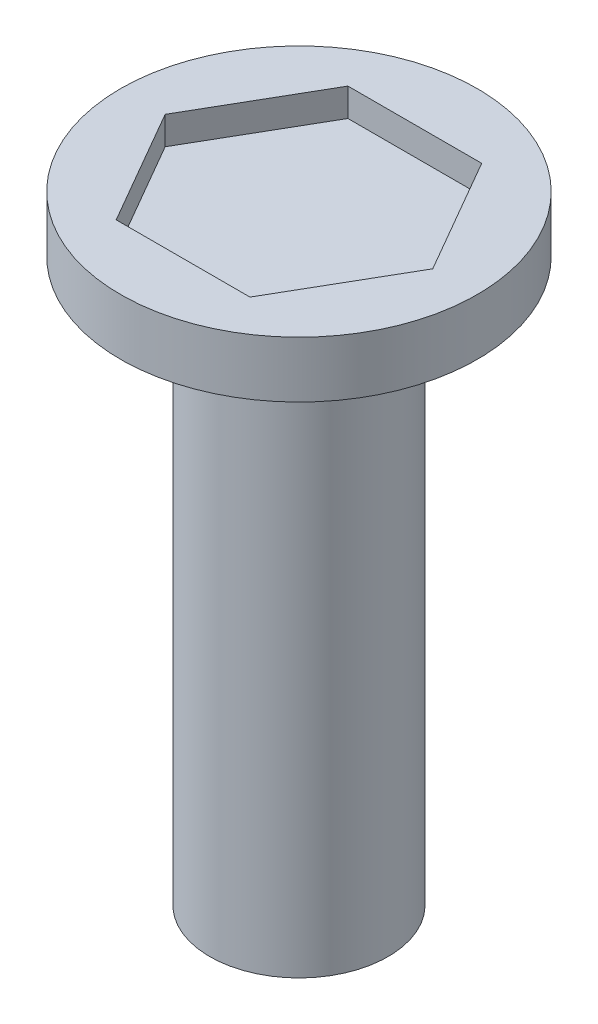
ISO-10303-21;
HEADER;
FILE_DESCRIPTION(('STEP AP214'),'2;1');
FILE_NAME('part.step','',(''),(''),'','','');
FILE_SCHEMA(('AUTOMOTIVE_DESIGN { 1 0 10303 214 1 1 1 1 }'));
ENDSEC;
DATA;
#1=APPLICATION_CONTEXT('core data for automotive mechanical design processes');
#2=APPLICATION_PROTOCOL_DEFINITION('international standard','automotive_design',2000,#1);
#3=PRODUCT_CONTEXT('',#1,'mechanical');
#4=PRODUCT('Part','Part','',(#3));
#5=PRODUCT_RELATED_PRODUCT_CATEGORY('part','',(#4));
#6=PRODUCT_DEFINITION_FORMATION('','',#4);
#7=PRODUCT_DEFINITION_CONTEXT('part definition',#1,'design');
#8=PRODUCT_DEFINITION('design','',#6,#7);
#9=PRODUCT_DEFINITION_SHAPE('','',#8);
#10=(LENGTH_UNIT() NAMED_UNIT(*) SI_UNIT(.MILLI.,.METRE.));
#11=(NAMED_UNIT(*) PLANE_ANGLE_UNIT() SI_UNIT($,.RADIAN.));
#12=(NAMED_UNIT(*) SI_UNIT($,.STERADIAN.) SOLID_ANGLE_UNIT());
#13=UNCERTAINTY_MEASURE_WITH_UNIT(LENGTH_MEASURE(1.E-05),#10,'distance_accuracy_value','');
#14=(GEOMETRIC_REPRESENTATION_CONTEXT(3) GLOBAL_UNCERTAINTY_ASSIGNED_CONTEXT((#13)) GLOBAL_UNIT_ASSIGNED_CONTEXT((#10,
#11,#12)) REPRESENTATION_CONTEXT('',''));
#15=CARTESIAN_POINT('',(0.,0.,0.));
#16=DIRECTION('',(0.,0.,1.));
#17=DIRECTION('',(1.,0.,0.));
#18=AXIS2_PLACEMENT_3D('',#15,#16,#17);
#19=CARTESIAN_POINT('',(3.175,0.,0.));
#20=DIRECTION('',(0.,1.,0.));
#21=DIRECTION('',(-1.,0.,0.));
#22=AXIS2_PLACEMENT_3D('',#19,#20,#21);
#23=CYLINDRICAL_SURFACE('',#22,3.175);
#24=CARTESIAN_POINT('',(3.175,-1.,0.));
#25=DIRECTION('',(0.,1.,0.));
#26=DIRECTION('',(-1.,0.,0.));
#27=AXIS2_PLACEMENT_3D('',#24,#25,#26);
#28=CIRCLE('',#27,3.175);
#29=CARTESIAN_POINT('',(0.,-1.,0.));
#30=VERTEX_POINT('',#29);
#31=EDGE_CURVE('E133',#30,#30,#28,.T.);
#32=ORIENTED_EDGE('',*,*,#31,.T.);
#33=EDGE_LOOP('',(#32));
#34=FACE_BOUND('',#33,.T.);
#35=CARTESIAN_POINT('',(3.175,0.,0.));
#36=DIRECTION('',(0.,1.,0.));
#37=DIRECTION('',(-1.,0.,0.));
#38=AXIS2_PLACEMENT_3D('',#35,#36,#37);
#39=CIRCLE('',#38,3.175);
#40=CARTESIAN_POINT('',(0.,0.,0.));
#41=VERTEX_POINT('',#40);
#42=EDGE_CURVE('E11',#41,#41,#39,.T.);
#43=ORIENTED_EDGE('',*,*,#42,.F.);
#44=EDGE_LOOP('',(#43));
#45=FACE_BOUND('',#44,.T.);
#46=ADVANCED_FACE('F32',(#34,#45),#23,.T.);
#47=CARTESIAN_POINT('',(0.,0.,0.));
#48=DIRECTION('',(0.,1.,0.));
#49=DIRECTION('',(-1.,0.,0.));
#50=AXIS2_PLACEMENT_3D('',#47,#48,#49);
#51=PLANE('',#50);
#52=DIRECTION('',(0.5,0.,-0.866025403784439));
#53=VECTOR('',#52,1.);
#54=CARTESIAN_POINT('',(4.365625,0.,2.06222299276169));
#55=LINE('',#54,#53);
#56=CARTESIAN_POINT('',(4.365625,0.,2.06222299276169));
#57=VERTEX_POINT('',#56);
#58=CARTESIAN_POINT('',(5.55625,0.,0.));
#59=VERTEX_POINT('',#58);
#60=EDGE_CURVE('E46',#57,#59,#55,.T.);
#61=ORIENTED_EDGE('',*,*,#60,.F.);
#62=DIRECTION('',(1.,0.,0.));
#63=VECTOR('',#62,1.);
#64=CARTESIAN_POINT('',(1.984375,0.,2.06222299276169));
#65=LINE('',#64,#63);
#66=CARTESIAN_POINT('',(1.984375,0.,2.06222299276169));
#67=VERTEX_POINT('',#66);
#68=EDGE_CURVE('E129',#67,#57,#65,.T.);
#69=ORIENTED_EDGE('',*,*,#68,.F.);
#70=DIRECTION('',(0.5,0.,0.866025403784438));
#71=VECTOR('',#70,1.);
#72=CARTESIAN_POINT('',(0.793749999999999,0.,0.));
#73=LINE('',#72,#71);
#74=CARTESIAN_POINT('',(0.793749999999999,0.,0.));
#75=VERTEX_POINT('',#74);
#76=EDGE_CURVE('E127',#75,#67,#73,.T.);
#77=ORIENTED_EDGE('',*,*,#76,.F.);
#78=DIRECTION('',(-0.5,0.,0.866025403784439));
#79=VECTOR('',#78,1.);
#80=CARTESIAN_POINT('',(1.984375,0.,-2.0622229927617));
#81=LINE('',#80,#79);
#82=CARTESIAN_POINT('',(1.984375,0.,-2.0622229927617));
#83=VERTEX_POINT('',#82);
#84=EDGE_CURVE('E94',#83,#75,#81,.T.);
#85=ORIENTED_EDGE('',*,*,#84,.F.);
#86=DIRECTION('',(-1.,0.,0.));
#87=VECTOR('',#86,1.);
#88=CARTESIAN_POINT('',(4.365625,0.,-2.0622229927617));
#89=LINE('',#88,#87);
#90=CARTESIAN_POINT('',(4.365625,0.,-2.0622229927617));
#91=VERTEX_POINT('',#90);
#92=EDGE_CURVE('E123',#91,#83,#89,.T.);
#93=ORIENTED_EDGE('',*,*,#92,.F.);
#94=DIRECTION('',(-0.5,0.,-0.866025403784439));
#95=VECTOR('',#94,1.);
#96=CARTESIAN_POINT('',(5.55625,0.,0.));
#97=LINE('',#96,#95);
#98=EDGE_CURVE('E120',#59,#91,#97,.T.);
#99=ORIENTED_EDGE('',*,*,#98,.F.);
#100=EDGE_LOOP('',(#61,#69,#77,#85,#93,#99));
#101=FACE_BOUND('',#100,.T.);
#102=ORIENTED_EDGE('',*,*,#42,.T.);
#103=EDGE_LOOP('',(#102));
#104=FACE_BOUND('',#103,.T.);
#105=ADVANCED_FACE('F151',(#101,#104),#51,.T.);
#106=CARTESIAN_POINT('',(3.175,-11.,0.));
#107=DIRECTION('',(0.,-1.,0.));
#108=DIRECTION('',(1.,0.,0.));
#109=AXIS2_PLACEMENT_3D('',#106,#107,#108);
#110=PLANE('',#109);
#111=CARTESIAN_POINT('',(3.175,-11.,0.));
#112=DIRECTION('',(0.,1.,0.));
#113=DIRECTION('',(-1.,0.,0.));
#114=AXIS2_PLACEMENT_3D('',#111,#112,#113);
#115=CIRCLE('',#114,1.5875);
#116=CARTESIAN_POINT('',(1.5875,-11.,0.));
#117=VERTEX_POINT('',#116);
#118=EDGE_CURVE('E39',#117,#117,#115,.T.);
#119=ORIENTED_EDGE('',*,*,#118,.F.);
#120=EDGE_LOOP('',(#119));
#121=FACE_BOUND('',#120,.T.);
#122=ADVANCED_FACE('F149',(#121),#110,.T.);
#123=CARTESIAN_POINT('',(3.175,0.,0.));
#124=DIRECTION('',(0.,1.,0.));
#125=DIRECTION('',(-1.,0.,0.));
#126=AXIS2_PLACEMENT_3D('',#123,#124,#125);
#127=CYLINDRICAL_SURFACE('',#126,1.5875);
#128=ORIENTED_EDGE('',*,*,#118,.T.);
#129=EDGE_LOOP('',(#128));
#130=FACE_BOUND('',#129,.T.);
#131=CARTESIAN_POINT('',(3.175,-1.,0.));
#132=DIRECTION('',(0.,1.,0.));
#133=DIRECTION('',(-1.,0.,0.));
#134=AXIS2_PLACEMENT_3D('',#131,#132,#133);
#135=CIRCLE('',#134,1.5875);
#136=CARTESIAN_POINT('',(1.5875,-1.,0.));
#137=VERTEX_POINT('',#136);
#138=EDGE_CURVE('E141',#137,#137,#135,.T.);
#139=ORIENTED_EDGE('',*,*,#138,.F.);
#140=EDGE_LOOP('',(#139));
#141=FACE_BOUND('',#140,.T.);
#142=ADVANCED_FACE('F146',(#130,#141),#127,.T.);
#143=CARTESIAN_POINT('',(1.5875,-1.,0.));
#144=DIRECTION('',(0.,-1.,0.));
#145=DIRECTION('',(1.,0.,0.));
#146=AXIS2_PLACEMENT_3D('',#143,#144,#145);
#147=PLANE('',#146);
#148=ORIENTED_EDGE('',*,*,#138,.T.);
#149=EDGE_LOOP('',(#148));
#150=FACE_BOUND('',#149,.T.);
#151=ORIENTED_EDGE('',*,*,#31,.F.);
#152=EDGE_LOOP('',(#151));
#153=FACE_BOUND('',#152,.T.);
#154=ADVANCED_FACE('F157',(#150,#153),#147,.T.);
#155=CARTESIAN_POINT('',(4.365625,-0.499999999999999,2.06222299276169));
#156=DIRECTION('',(0.866025403784439,0.,0.5));
#157=DIRECTION('',(0.5,0.,-0.866025403784439));
#158=AXIS2_PLACEMENT_3D('',#155,#156,#157);
#159=PLANE('',#158);
#160=ORIENTED_EDGE('',*,*,#60,.T.);
#161=DIRECTION('',(0.,1.,0.));
#162=VECTOR('',#161,1.);
#163=CARTESIAN_POINT('',(5.55625,-0.499999999999999,0.));
#164=LINE('',#163,#162);
#165=CARTESIAN_POINT('',(5.55625,-0.499999999999999,0.));
#166=VERTEX_POINT('',#165);
#167=EDGE_CURVE('E76',#166,#59,#164,.T.);
#168=ORIENTED_EDGE('',*,*,#167,.F.);
#169=DIRECTION('',(0.5,0.,-0.866025403784439));
#170=VECTOR('',#169,1.);
#171=CARTESIAN_POINT('',(4.365625,-0.499999999999999,2.06222299276169));
#172=LINE('',#171,#170);
#173=CARTESIAN_POINT('',(4.365625,-0.499999999999999,2.06222299276169));
#174=VERTEX_POINT('',#173);
#175=EDGE_CURVE('E131',#174,#166,#172,.T.);
#176=ORIENTED_EDGE('',*,*,#175,.F.);
#177=DIRECTION('',(0.,1.,0.));
#178=VECTOR('',#177,1.);
#179=CARTESIAN_POINT('',(4.365625,-0.499999999999999,2.06222299276169));
#180=LINE('',#179,#178);
#181=EDGE_CURVE('E54',#174,#57,#180,.T.);
#182=ORIENTED_EDGE('',*,*,#181,.T.);
#183=EDGE_LOOP('',(#160,#168,#176,#182));
#184=FACE_BOUND('',#183,.T.);
#185=ADVANCED_FACE('F170',(#184),#159,.F.);
#186=CARTESIAN_POINT('',(1.984375,-0.5,2.06222299276169));
#187=DIRECTION('',(0.,0.,1.));
#188=DIRECTION('',(1.,0.,0.));
#189=AXIS2_PLACEMENT_3D('',#186,#187,#188);
#190=PLANE('',#189);
#191=ORIENTED_EDGE('',*,*,#68,.T.);
#192=ORIENTED_EDGE('',*,*,#181,.F.);
#193=DIRECTION('',(1.,0.,0.));
#194=VECTOR('',#193,1.);
#195=CARTESIAN_POINT('',(1.984375,-0.5,2.06222299276169));
#196=LINE('',#195,#194);
#197=CARTESIAN_POINT('',(1.984375,-0.5,2.06222299276169));
#198=VERTEX_POINT('',#197);
#199=EDGE_CURVE('E106',#198,#174,#196,.T.);
#200=ORIENTED_EDGE('',*,*,#199,.F.);
#201=DIRECTION('',(0.,1.,0.));
#202=VECTOR('',#201,1.);
#203=CARTESIAN_POINT('',(1.984375,-0.5,2.06222299276169));
#204=LINE('',#203,#202);
#205=EDGE_CURVE('E98',#198,#67,#204,.T.);
#206=ORIENTED_EDGE('',*,*,#205,.T.);
#207=EDGE_LOOP('',(#191,#192,#200,#206));
#208=FACE_BOUND('',#207,.T.);
#209=ADVANCED_FACE('F176',(#208),#190,.F.);
#210=CARTESIAN_POINT('',(0.79375,-0.5,0.));
#211=DIRECTION('',(-0.866025403784438,0.,0.5));
#212=DIRECTION('',(0.5,0.,0.866025403784439));
#213=AXIS2_PLACEMENT_3D('',#210,#211,#212);
#214=PLANE('',#213);
#215=ORIENTED_EDGE('',*,*,#76,.T.);
#216=ORIENTED_EDGE('',*,*,#205,.F.);
#217=DIRECTION('',(0.5,0.,0.866025403784438));
#218=VECTOR('',#217,1.);
#219=CARTESIAN_POINT('',(0.79375,-0.5,0.));
#220=LINE('',#219,#218);
#221=CARTESIAN_POINT('',(0.79375,-0.5,0.));
#222=VERTEX_POINT('',#221);
#223=EDGE_CURVE('E102',#222,#198,#220,.T.);
#224=ORIENTED_EDGE('',*,*,#223,.F.);
#225=DIRECTION('',(0.,1.,0.));
#226=VECTOR('',#225,1.);
#227=CARTESIAN_POINT('',(0.79375,-0.5,0.));
#228=LINE('',#227,#226);
#229=EDGE_CURVE('E87',#222,#75,#228,.T.);
#230=ORIENTED_EDGE('',*,*,#229,.T.);
#231=EDGE_LOOP('',(#215,#216,#224,#230));
#232=FACE_BOUND('',#231,.T.);
#233=ADVANCED_FACE('F103',(#232),#214,.F.);
#234=CARTESIAN_POINT('',(1.984375,-0.5,-2.0622229927617));
#235=DIRECTION('',(-0.866025403784439,0.,-0.5));
#236=DIRECTION('',(-0.5,0.,0.866025403784439));
#237=AXIS2_PLACEMENT_3D('',#234,#235,#236);
#238=PLANE('',#237);
#239=ORIENTED_EDGE('',*,*,#84,.T.);
#240=ORIENTED_EDGE('',*,*,#229,.F.);
#241=DIRECTION('',(-0.5,0.,0.866025403784439));
#242=VECTOR('',#241,1.);
#243=CARTESIAN_POINT('',(1.984375,-0.5,-2.0622229927617));
#244=LINE('',#243,#242);
#245=CARTESIAN_POINT('',(1.984375,-0.5,-2.0622229927617));
#246=VERTEX_POINT('',#245);
#247=EDGE_CURVE('E91',#246,#222,#244,.T.);
#248=ORIENTED_EDGE('',*,*,#247,.F.);
#249=DIRECTION('',(0.,1.,0.));
#250=VECTOR('',#249,1.);
#251=CARTESIAN_POINT('',(1.984375,-0.5,-2.0622229927617));
#252=LINE('',#251,#250);
#253=EDGE_CURVE('E99',#246,#83,#252,.T.);
#254=ORIENTED_EDGE('',*,*,#253,.T.);
#255=EDGE_LOOP('',(#239,#240,#248,#254));
#256=FACE_BOUND('',#255,.T.);
#257=ADVANCED_FACE('F89',(#256),#238,.F.);
#258=CARTESIAN_POINT('',(4.365625,-0.499999999999999,-2.0622229927617));
#259=DIRECTION('',(0.,0.,-1.));
#260=DIRECTION('',(-1.,0.,0.));
#261=AXIS2_PLACEMENT_3D('',#258,#259,#260);
#262=PLANE('',#261);
#263=ORIENTED_EDGE('',*,*,#92,.T.);
#264=ORIENTED_EDGE('',*,*,#253,.F.);
#265=DIRECTION('',(-1.,0.,0.));
#266=VECTOR('',#265,1.);
#267=CARTESIAN_POINT('',(4.365625,-0.499999999999999,-2.0622229927617));
#268=LINE('',#267,#266);
#269=CARTESIAN_POINT('',(4.365625,-0.499999999999999,-2.0622229927617));
#270=VERTEX_POINT('',#269);
#271=EDGE_CURVE('E112',#270,#246,#268,.T.);
#272=ORIENTED_EDGE('',*,*,#271,.F.);
#273=DIRECTION('',(0.,1.,0.));
#274=VECTOR('',#273,1.);
#275=CARTESIAN_POINT('',(4.365625,-0.499999999999999,-2.0622229927617));
#276=LINE('',#275,#274);
#277=EDGE_CURVE('E136',#270,#91,#276,.T.);
#278=ORIENTED_EDGE('',*,*,#277,.T.);
#279=EDGE_LOOP('',(#263,#264,#272,#278));
#280=FACE_BOUND('',#279,.T.);
#281=ADVANCED_FACE('F182',(#280),#262,.F.);
#282=CARTESIAN_POINT('',(5.55625,-0.499999999999999,0.));
#283=DIRECTION('',(0.866025403784439,0.,-0.5));
#284=DIRECTION('',(-0.5,0.,-0.866025403784439));
#285=AXIS2_PLACEMENT_3D('',#282,#283,#284);
#286=PLANE('',#285);
#287=ORIENTED_EDGE('',*,*,#98,.T.);
#288=ORIENTED_EDGE('',*,*,#277,.F.);
#289=DIRECTION('',(-0.5,0.,-0.866025403784439));
#290=VECTOR('',#289,1.);
#291=CARTESIAN_POINT('',(5.55625,-0.499999999999999,0.));
#292=LINE('',#291,#290);
#293=EDGE_CURVE('E114',#166,#270,#292,.T.);
#294=ORIENTED_EDGE('',*,*,#293,.F.);
#295=ORIENTED_EDGE('',*,*,#167,.T.);
#296=EDGE_LOOP('',(#287,#288,#294,#295));
#297=FACE_BOUND('',#296,.T.);
#298=ADVANCED_FACE('F179',(#297),#286,.F.);
#299=CARTESIAN_POINT('',(0.,-0.5,0.));
#300=DIRECTION('',(0.,1.,0.));
#301=DIRECTION('',(-1.,0.,0.));
#302=AXIS2_PLACEMENT_3D('',#299,#300,#301);
#303=PLANE('',#302);
#304=ORIENTED_EDGE('',*,*,#175,.T.);
#305=ORIENTED_EDGE('',*,*,#293,.T.);
#306=ORIENTED_EDGE('',*,*,#271,.T.);
#307=ORIENTED_EDGE('',*,*,#247,.T.);
#308=ORIENTED_EDGE('',*,*,#223,.T.);
#309=ORIENTED_EDGE('',*,*,#199,.T.);
#310=EDGE_LOOP('',(#304,#305,#306,#307,#308,#309));
#311=FACE_BOUND('',#310,.T.);
#312=ADVANCED_FACE('F109',(#311),#303,.T.);
#313=CLOSED_SHELL('',(#46,#105,#122,#142,#154,#185,#209,#233,#257,#281,#298,#312));
#314=MANIFOLD_SOLID_BREP('B2',#313);
#315=ADVANCED_BREP_SHAPE_REPRESENTATION('',(#18,#314),#14);
#316=SHAPE_DEFINITION_REPRESENTATION(#9,#315);
ENDSEC;
END-ISO-10303-21;
